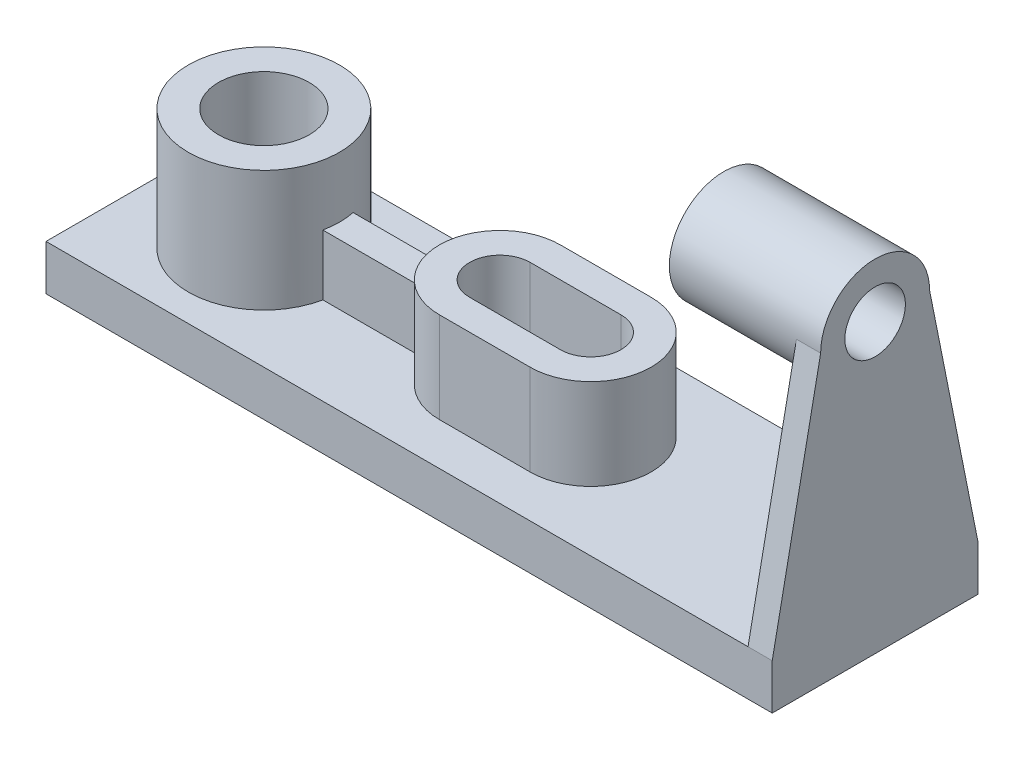
ISO-10303-21;
HEADER;
FILE_DESCRIPTION(('STEP AP214'),'2;1');
FILE_NAME('part.step','',(''),(''),'','','');
FILE_SCHEMA(('AUTOMOTIVE_DESIGN { 1 0 10303 214 1 1 1 1 }'));
ENDSEC;
DATA;
#1=APPLICATION_CONTEXT('core data for automotive mechanical design processes');
#2=APPLICATION_PROTOCOL_DEFINITION('international standard','automotive_design',2000,#1);
#3=PRODUCT_CONTEXT('',#1,'mechanical');
#4=PRODUCT('Part','Part','',(#3));
#5=PRODUCT_RELATED_PRODUCT_CATEGORY('part','',(#4));
#6=PRODUCT_DEFINITION_FORMATION('','',#4);
#7=PRODUCT_DEFINITION_CONTEXT('part definition',#1,'design');
#8=PRODUCT_DEFINITION('design','',#6,#7);
#9=PRODUCT_DEFINITION_SHAPE('','',#8);
#10=(LENGTH_UNIT() NAMED_UNIT(*) SI_UNIT(.MILLI.,.METRE.));
#11=(NAMED_UNIT(*) PLANE_ANGLE_UNIT() SI_UNIT($,.RADIAN.));
#12=(NAMED_UNIT(*) SI_UNIT($,.STERADIAN.) SOLID_ANGLE_UNIT());
#13=UNCERTAINTY_MEASURE_WITH_UNIT(LENGTH_MEASURE(1.E-05),#10,'distance_accuracy_value','');
#14=(GEOMETRIC_REPRESENTATION_CONTEXT(3) GLOBAL_UNCERTAINTY_ASSIGNED_CONTEXT((#13)) GLOBAL_UNIT_ASSIGNED_CONTEXT((#10,
#11,#12)) REPRESENTATION_CONTEXT('',''));
#15=CARTESIAN_POINT('',(0.,0.,0.));
#16=DIRECTION('',(0.,0.,1.));
#17=DIRECTION('',(1.,0.,0.));
#18=AXIS2_PLACEMENT_3D('',#15,#16,#17);
#19=CARTESIAN_POINT('',(112.,95.,0.));
#20=DIRECTION('',(1.,0.,0.));
#21=DIRECTION('',(0.,0.,-1.));
#22=AXIS2_PLACEMENT_3D('',#19,#20,#21);
#23=PLANE('',#22);
#24=CARTESIAN_POINT('',(112.,95.,0.));
#25=DIRECTION('',(1.,0.,0.));
#26=DIRECTION('',(0.,0.,-1.));
#27=AXIS2_PLACEMENT_3D('',#24,#25,#26);
#28=CIRCLE('',#27,18.);
#29=CARTESIAN_POINT('',(112.,95.,-18.));
#30=VERTEX_POINT('',#29);
#31=CARTESIAN_POINT('',(112.,95.,18.));
#32=VERTEX_POINT('',#31);
#33=EDGE_CURVE('E12',#30,#32,#28,.F.);
#34=ORIENTED_EDGE('',*,*,#33,.F.);
#35=DIRECTION('',(0.,0.98058067569092,0.196116135138183));
#36=VECTOR('',#35,1.);
#37=CARTESIAN_POINT('',(112.,95.,-18.));
#38=LINE('',#37,#36);
#39=CARTESIAN_POINT('',(112.,15.,-34.));
#40=VERTEX_POINT('',#39);
#41=EDGE_CURVE('E176',#40,#30,#38,.T.);
#42=ORIENTED_EDGE('',*,*,#41,.F.);
#43=DIRECTION('',(0.,0.,-1.));
#44=VECTOR('',#43,1.);
#45=CARTESIAN_POINT('',(112.,15.,34.));
#46=LINE('',#45,#44);
#47=CARTESIAN_POINT('',(112.,15.,34.));
#48=VERTEX_POINT('',#47);
#49=EDGE_CURVE('E58',#48,#40,#46,.T.);
#50=ORIENTED_EDGE('',*,*,#49,.F.);
#51=DIRECTION('',(0.,-0.98058067569092,0.196116135138185));
#52=VECTOR('',#51,1.);
#53=CARTESIAN_POINT('',(112.,95.,18.));
#54=LINE('',#53,#52);
#55=EDGE_CURVE('E178',#32,#48,#54,.T.);
#56=ORIENTED_EDGE('',*,*,#55,.F.);
#57=EDGE_LOOP('',(#34,#42,#50,#56));
#58=FACE_BOUND('',#57,.T.);
#59=ADVANCED_FACE('F43',(#58),#23,.F.);
#60=CARTESIAN_POINT('',(0.,15.,0.));
#61=DIRECTION('',(0.,1.,0.));
#62=DIRECTION('',(0.,0.,1.));
#63=AXIS2_PLACEMENT_3D('',#60,#61,#62);
#64=PLANE('',#63);
#65=DIRECTION('',(1.,0.,0.));
#66=VECTOR('',#65,1.);
#67=CARTESIAN_POINT('',(0.,15.,5.));
#68=LINE('',#67,#66);
#69=CARTESIAN_POINT('',(-57.5051025721682,15.,5.));
#70=VERTEX_POINT('',#69);
#71=CARTESIAN_POINT('',(-23.3649167310371,15.,5.));
#72=VERTEX_POINT('',#71);
#73=EDGE_CURVE('E224',#70,#72,#68,.T.);
#74=ORIENTED_EDGE('',*,*,#73,.F.);
#75=CARTESIAN_POINT('',(-82.,15.,0.));
#76=DIRECTION('',(0.,1.,0.));
#77=DIRECTION('',(0.,0.,1.));
#78=AXIS2_PLACEMENT_3D('',#75,#76,#77);
#79=CIRCLE('',#78,25.);
#80=CARTESIAN_POINT('',(-57.5051025721682,15.,-5.));
#81=VERTEX_POINT('',#80);
#82=EDGE_CURVE('E301',#81,#70,#79,.T.);
#83=ORIENTED_EDGE('',*,*,#82,.F.);
#84=DIRECTION('',(1.,0.,0.));
#85=VECTOR('',#84,1.);
#86=CARTESIAN_POINT('',(0.,15.,-5.));
#87=LINE('',#86,#85);
#88=CARTESIAN_POINT('',(-23.3649167310371,15.,-5.));
#89=VERTEX_POINT('',#88);
#90=EDGE_CURVE('E215',#81,#89,#87,.T.);
#91=ORIENTED_EDGE('',*,*,#90,.T.);
#92=CARTESIAN_POINT('',(-4.,15.,0.));
#93=DIRECTION('',(0.,1.,0.));
#94=DIRECTION('',(0.,0.,1.));
#95=AXIS2_PLACEMENT_3D('',#92,#93,#94);
#96=CIRCLE('',#95,20.);
#97=CARTESIAN_POINT('',(-4.,15.,-20.));
#98=VERTEX_POINT('',#97);
#99=EDGE_CURVE('E277',#98,#89,#96,.T.);
#100=ORIENTED_EDGE('',*,*,#99,.F.);
#101=DIRECTION('',(1.,0.,0.));
#102=VECTOR('',#101,1.);
#103=CARTESIAN_POINT('',(-4.,15.,-20.));
#104=LINE('',#103,#102);
#105=CARTESIAN_POINT('',(26.,15.,-20.));
#106=VERTEX_POINT('',#105);
#107=EDGE_CURVE('E269',#98,#106,#104,.T.);
#108=ORIENTED_EDGE('',*,*,#107,.T.);
#109=CARTESIAN_POINT('',(26.,15.,0.));
#110=DIRECTION('',(0.,1.,0.));
#111=DIRECTION('',(0.,0.,1.));
#112=AXIS2_PLACEMENT_3D('',#109,#110,#111);
#113=CIRCLE('',#112,20.);
#114=CARTESIAN_POINT('',(26.,15.,20.));
#115=VERTEX_POINT('',#114);
#116=EDGE_CURVE('E282',#115,#106,#113,.T.);
#117=ORIENTED_EDGE('',*,*,#116,.F.);
#118=DIRECTION('',(1.,0.,0.));
#119=VECTOR('',#118,1.);
#120=CARTESIAN_POINT('',(-4.,15.,20.));
#121=LINE('',#120,#119);
#122=CARTESIAN_POINT('',(-4.,15.,20.));
#123=VERTEX_POINT('',#122);
#124=EDGE_CURVE('E279',#123,#115,#121,.T.);
#125=ORIENTED_EDGE('',*,*,#124,.F.);
#126=EDGE_CURVE('E264',#72,#123,#96,.T.);
#127=ORIENTED_EDGE('',*,*,#126,.F.);
#128=EDGE_LOOP('',(#74,#83,#91,#100,#108,#117,#125,#127));
#129=FACE_BOUND('',#128,.T.);
#130=DIRECTION('',(1.,0.,0.));
#131=VECTOR('',#130,1.);
#132=CARTESIAN_POINT('',(-120.,15.,34.));
#133=LINE('',#132,#131);
#134=CARTESIAN_POINT('',(-120.,15.,34.));
#135=VERTEX_POINT('',#134);
#136=EDGE_CURVE('E311',#135,#48,#133,.T.);
#137=ORIENTED_EDGE('',*,*,#136,.T.);
#138=ORIENTED_EDGE('',*,*,#49,.T.);
#139=DIRECTION('',(-1.,0.,0.));
#140=VECTOR('',#139,1.);
#141=CARTESIAN_POINT('',(-120.,15.,-34.));
#142=LINE('',#141,#140);
#143=CARTESIAN_POINT('',(-120.,15.,-34.));
#144=VERTEX_POINT('',#143);
#145=EDGE_CURVE('E309',#40,#144,#142,.T.);
#146=ORIENTED_EDGE('',*,*,#145,.T.);
#147=DIRECTION('',(0.,0.,1.));
#148=VECTOR('',#147,1.);
#149=CARTESIAN_POINT('',(-120.,15.,-34.));
#150=LINE('',#149,#148);
#151=EDGE_CURVE('E308',#144,#135,#150,.T.);
#152=ORIENTED_EDGE('',*,*,#151,.T.);
#153=EDGE_LOOP('',(#137,#138,#146,#152));
#154=FACE_BOUND('',#153,.T.);
#155=ADVANCED_FACE('F357',(#129,#154),#64,.T.);
#156=CARTESIAN_POINT('',(120.,15.,-34.));
#157=DIRECTION('',(-1.,0.,0.));
#158=DIRECTION('',(0.,0.,1.));
#159=AXIS2_PLACEMENT_3D('',#156,#157,#158);
#160=PLANE('',#159);
#161=CARTESIAN_POINT('',(120.,95.,0.));
#162=DIRECTION('',(-1.,0.,0.));
#163=DIRECTION('',(0.,0.,1.));
#164=AXIS2_PLACEMENT_3D('',#161,#162,#163);
#165=CIRCLE('',#164,10.);
#166=CARTESIAN_POINT('',(120.,95.,9.99999999999995));
#167=VERTEX_POINT('',#166);
#168=EDGE_CURVE('E450',#167,#167,#165,.T.);
#169=ORIENTED_EDGE('',*,*,#168,.T.);
#170=EDGE_LOOP('',(#169));
#171=FACE_BOUND('',#170,.T.);
#172=DIRECTION('',(0.,0.,-1.));
#173=VECTOR('',#172,1.);
#174=CARTESIAN_POINT('',(120.,0.,-34.));
#175=LINE('',#174,#173);
#176=CARTESIAN_POINT('',(120.,0.,34.));
#177=VERTEX_POINT('',#176);
#178=CARTESIAN_POINT('',(120.,0.,-34.));
#179=VERTEX_POINT('',#178);
#180=EDGE_CURVE('E305',#177,#179,#175,.T.);
#181=ORIENTED_EDGE('',*,*,#180,.T.);
#182=DIRECTION('',(0.,-1.,0.));
#183=VECTOR('',#182,1.);
#184=CARTESIAN_POINT('',(120.,15.,-34.));
#185=LINE('',#184,#183);
#186=CARTESIAN_POINT('',(120.,15.,-34.));
#187=VERTEX_POINT('',#186);
#188=EDGE_CURVE('E51',#187,#179,#185,.T.);
#189=ORIENTED_EDGE('',*,*,#188,.F.);
#190=DIRECTION('',(0.,0.98058067569092,0.196116135138183));
#191=VECTOR('',#190,1.);
#192=CARTESIAN_POINT('',(120.,95.,-18.));
#193=LINE('',#192,#191);
#194=CARTESIAN_POINT('',(120.,95.,-18.));
#195=VERTEX_POINT('',#194);
#196=EDGE_CURVE('E206',#187,#195,#193,.T.);
#197=ORIENTED_EDGE('',*,*,#196,.T.);
#198=CARTESIAN_POINT('',(120.,95.,0.));
#199=DIRECTION('',(1.,0.,0.));
#200=DIRECTION('',(0.,0.,-1.));
#201=AXIS2_PLACEMENT_3D('',#198,#199,#200);
#202=CIRCLE('',#201,18.);
#203=CARTESIAN_POINT('',(120.,95.,17.9999999999999));
#204=VERTEX_POINT('',#203);
#205=EDGE_CURVE('E186',#195,#204,#202,.T.);
#206=ORIENTED_EDGE('',*,*,#205,.T.);
#207=DIRECTION('',(0.,-0.98058067569092,0.196116135138185));
#208=VECTOR('',#207,1.);
#209=CARTESIAN_POINT('',(120.,95.,17.9999999999999));
#210=LINE('',#209,#208);
#211=CARTESIAN_POINT('',(120.,15.,34.));
#212=VERTEX_POINT('',#211);
#213=EDGE_CURVE('E202',#204,#212,#210,.T.);
#214=ORIENTED_EDGE('',*,*,#213,.T.);
#215=DIRECTION('',(0.,-1.,0.));
#216=VECTOR('',#215,1.);
#217=CARTESIAN_POINT('',(120.,15.,34.));
#218=LINE('',#217,#216);
#219=EDGE_CURVE('E313',#212,#177,#218,.T.);
#220=ORIENTED_EDGE('',*,*,#219,.T.);
#221=EDGE_LOOP('',(#181,#189,#197,#206,#214,#220));
#222=FACE_BOUND('',#221,.T.);
#223=ADVANCED_FACE('F45',(#171,#222),#160,.F.);
#224=CARTESIAN_POINT('',(-120.,15.,-34.));
#225=DIRECTION('',(0.,0.,1.));
#226=DIRECTION('',(1.,0.,0.));
#227=AXIS2_PLACEMENT_3D('',#224,#225,#226);
#228=PLANE('',#227);
#229=DIRECTION('',(-1.,0.,0.));
#230=VECTOR('',#229,1.);
#231=CARTESIAN_POINT('',(-120.,0.,-34.));
#232=LINE('',#231,#230);
#233=CARTESIAN_POINT('',(-120.,0.,-34.));
#234=VERTEX_POINT('',#233);
#235=EDGE_CURVE('E315',#179,#234,#232,.T.);
#236=ORIENTED_EDGE('',*,*,#235,.T.);
#237=DIRECTION('',(0.,-1.,0.));
#238=VECTOR('',#237,1.);
#239=CARTESIAN_POINT('',(-120.,15.,-34.));
#240=LINE('',#239,#238);
#241=EDGE_CURVE('E326',#144,#234,#240,.T.);
#242=ORIENTED_EDGE('',*,*,#241,.F.);
#243=ORIENTED_EDGE('',*,*,#145,.F.);
#244=EDGE_CURVE('E194',#187,#40,#142,.T.);
#245=ORIENTED_EDGE('',*,*,#244,.F.);
#246=ORIENTED_EDGE('',*,*,#188,.T.);
#247=EDGE_LOOP('',(#236,#242,#243,#245,#246));
#248=FACE_BOUND('',#247,.T.);
#249=ADVANCED_FACE('F484',(#248),#228,.F.);
#250=CARTESIAN_POINT('',(-120.,15.,-34.));
#251=DIRECTION('',(1.,0.,0.));
#252=DIRECTION('',(0.,0.,-1.));
#253=AXIS2_PLACEMENT_3D('',#250,#251,#252);
#254=PLANE('',#253);
#255=DIRECTION('',(0.,-1.,0.));
#256=VECTOR('',#255,1.);
#257=CARTESIAN_POINT('',(-120.,15.,34.));
#258=LINE('',#257,#256);
#259=CARTESIAN_POINT('',(-120.,0.,34.));
#260=VERTEX_POINT('',#259);
#261=EDGE_CURVE('E323',#135,#260,#258,.T.);
#262=ORIENTED_EDGE('',*,*,#261,.F.);
#263=ORIENTED_EDGE('',*,*,#151,.F.);
#264=ORIENTED_EDGE('',*,*,#241,.T.);
#265=DIRECTION('',(0.,0.,1.));
#266=VECTOR('',#265,1.);
#267=CARTESIAN_POINT('',(-120.,0.,-34.));
#268=LINE('',#267,#266);
#269=EDGE_CURVE('E317',#234,#260,#268,.T.);
#270=ORIENTED_EDGE('',*,*,#269,.T.);
#271=EDGE_LOOP('',(#262,#263,#264,#270));
#272=FACE_BOUND('',#271,.T.);
#273=ADVANCED_FACE('F520',(#272),#254,.F.);
#274=CARTESIAN_POINT('',(-120.,15.,34.));
#275=DIRECTION('',(0.,0.,-1.));
#276=DIRECTION('',(-1.,0.,0.));
#277=AXIS2_PLACEMENT_3D('',#274,#275,#276);
#278=PLANE('',#277);
#279=DIRECTION('',(1.,0.,0.));
#280=VECTOR('',#279,1.);
#281=CARTESIAN_POINT('',(-120.,0.,34.));
#282=LINE('',#281,#280);
#283=EDGE_CURVE('E319',#260,#177,#282,.T.);
#284=ORIENTED_EDGE('',*,*,#283,.T.);
#285=ORIENTED_EDGE('',*,*,#219,.F.);
#286=DIRECTION('',(1.,0.,0.));
#287=VECTOR('',#286,1.);
#288=CARTESIAN_POINT('',(112.,15.,34.));
#289=LINE('',#288,#287);
#290=EDGE_CURVE('E66',#48,#212,#289,.T.);
#291=ORIENTED_EDGE('',*,*,#290,.F.);
#292=ORIENTED_EDGE('',*,*,#136,.F.);
#293=ORIENTED_EDGE('',*,*,#261,.T.);
#294=EDGE_LOOP('',(#284,#285,#291,#292,#293));
#295=FACE_BOUND('',#294,.T.);
#296=ADVANCED_FACE('F354',(#295),#278,.F.);
#297=CARTESIAN_POINT('',(0.,0.,0.));
#298=DIRECTION('',(0.,1.,0.));
#299=DIRECTION('',(0.,0.,1.));
#300=AXIS2_PLACEMENT_3D('',#297,#298,#299);
#301=PLANE('',#300);
#302=CARTESIAN_POINT('',(-82.,0.,0.));
#303=DIRECTION('',(0.,1.,0.));
#304=DIRECTION('',(0.,0.,1.));
#305=AXIS2_PLACEMENT_3D('',#302,#303,#304);
#306=CIRCLE('',#305,15.);
#307=CARTESIAN_POINT('',(-82.,0.,15.));
#308=VERTEX_POINT('',#307);
#309=EDGE_CURVE('E297',#308,#308,#306,.T.);
#310=ORIENTED_EDGE('',*,*,#309,.T.);
#311=EDGE_LOOP('',(#310));
#312=FACE_BOUND('',#311,.T.);
#313=CARTESIAN_POINT('',(-4.,0.,0.));
#314=DIRECTION('',(0.,1.,0.));
#315=DIRECTION('',(0.,0.,1.));
#316=AXIS2_PLACEMENT_3D('',#313,#314,#315);
#317=CIRCLE('',#316,10.);
#318=CARTESIAN_POINT('',(-4.,0.,-10.));
#319=VERTEX_POINT('',#318);
#320=CARTESIAN_POINT('',(-4.,0.,10.));
#321=VERTEX_POINT('',#320);
#322=EDGE_CURVE('E262',#319,#321,#317,.T.);
#323=ORIENTED_EDGE('',*,*,#322,.T.);
#324=DIRECTION('',(1.,0.,0.));
#325=VECTOR('',#324,1.);
#326=CARTESIAN_POINT('',(0.,0.,10.));
#327=LINE('',#326,#325);
#328=CARTESIAN_POINT('',(26.,0.,10.));
#329=VERTEX_POINT('',#328);
#330=EDGE_CURVE('E248',#321,#329,#327,.T.);
#331=ORIENTED_EDGE('',*,*,#330,.T.);
#332=CARTESIAN_POINT('',(26.,0.,0.));
#333=DIRECTION('',(0.,1.,0.));
#334=DIRECTION('',(0.,0.,1.));
#335=AXIS2_PLACEMENT_3D('',#332,#333,#334);
#336=CIRCLE('',#335,10.);
#337=CARTESIAN_POINT('',(26.,0.,-10.));
#338=VERTEX_POINT('',#337);
#339=EDGE_CURVE('E257',#329,#338,#336,.T.);
#340=ORIENTED_EDGE('',*,*,#339,.T.);
#341=DIRECTION('',(-1.,0.,0.));
#342=VECTOR('',#341,1.);
#343=CARTESIAN_POINT('',(0.,0.,-10.));
#344=LINE('',#343,#342);
#345=EDGE_CURVE('E259',#338,#319,#344,.T.);
#346=ORIENTED_EDGE('',*,*,#345,.T.);
#347=EDGE_LOOP('',(#323,#331,#340,#346));
#348=FACE_BOUND('',#347,.T.);
#349=ORIENTED_EDGE('',*,*,#283,.F.);
#350=ORIENTED_EDGE('',*,*,#269,.F.);
#351=ORIENTED_EDGE('',*,*,#235,.F.);
#352=ORIENTED_EDGE('',*,*,#180,.F.);
#353=EDGE_LOOP('',(#349,#350,#351,#352));
#354=FACE_BOUND('',#353,.T.);
#355=ADVANCED_FACE('F333',(#312,#348,#354),#301,.F.);
#356=CARTESIAN_POINT('',(-82.,55.,0.));
#357=DIRECTION('',(0.,1.,0.));
#358=DIRECTION('',(0.,0.,1.));
#359=AXIS2_PLACEMENT_3D('',#356,#357,#358);
#360=PLANE('',#359);
#361=CARTESIAN_POINT('',(-82.,55.,0.));
#362=DIRECTION('',(0.,1.,0.));
#363=DIRECTION('',(0.,0.,1.));
#364=AXIS2_PLACEMENT_3D('',#361,#362,#363);
#365=CIRCLE('',#364,25.);
#366=CARTESIAN_POINT('',(-82.,55.,25.));
#367=VERTEX_POINT('',#366);
#368=EDGE_CURVE('E302',#367,#367,#365,.T.);
#369=ORIENTED_EDGE('',*,*,#368,.T.);
#370=EDGE_LOOP('',(#369));
#371=FACE_BOUND('',#370,.T.);
#372=CARTESIAN_POINT('',(-82.,55.,0.));
#373=DIRECTION('',(0.,1.,0.));
#374=DIRECTION('',(0.,0.,1.));
#375=AXIS2_PLACEMENT_3D('',#372,#373,#374);
#376=CIRCLE('',#375,15.);
#377=CARTESIAN_POINT('',(-82.,55.,15.));
#378=VERTEX_POINT('',#377);
#379=EDGE_CURVE('E298',#378,#378,#376,.T.);
#380=ORIENTED_EDGE('',*,*,#379,.F.);
#381=EDGE_LOOP('',(#380));
#382=FACE_BOUND('',#381,.T.);
#383=ADVANCED_FACE('F344',(#371,#382),#360,.T.);
#384=CARTESIAN_POINT('',(-82.,55.,0.));
#385=DIRECTION('',(0.,-1.,0.));
#386=DIRECTION('',(0.,0.,-1.));
#387=AXIS2_PLACEMENT_3D('',#384,#385,#386);
#388=CYLINDRICAL_SURFACE('',#387,25.);
#389=ORIENTED_EDGE('',*,*,#82,.T.);
#390=DIRECTION('',(0.,-1.,0.));
#391=VECTOR('',#390,1.);
#392=CARTESIAN_POINT('',(-57.5051025721682,55.,5.));
#393=LINE('',#392,#391);
#394=CARTESIAN_POINT('',(-57.5051025721682,35.,5.));
#395=VERTEX_POINT('',#394);
#396=EDGE_CURVE('E227',#70,#395,#393,.F.);
#397=ORIENTED_EDGE('',*,*,#396,.T.);
#398=CARTESIAN_POINT('',(-82.,35.,0.));
#399=DIRECTION('',(0.,-1.,0.));
#400=DIRECTION('',(0.,0.,-1.));
#401=AXIS2_PLACEMENT_3D('',#398,#399,#400);
#402=CIRCLE('',#401,25.);
#403=CARTESIAN_POINT('',(-57.5051025721682,35.,-5.));
#404=VERTEX_POINT('',#403);
#405=EDGE_CURVE('E232',#395,#404,#402,.F.);
#406=ORIENTED_EDGE('',*,*,#405,.T.);
#407=DIRECTION('',(0.,-1.,0.));
#408=VECTOR('',#407,1.);
#409=CARTESIAN_POINT('',(-57.5051025721682,55.,-5.));
#410=LINE('',#409,#408);
#411=EDGE_CURVE('E218',#81,#404,#410,.F.);
#412=ORIENTED_EDGE('',*,*,#411,.F.);
#413=EDGE_LOOP('',(#389,#397,#406,#412));
#414=FACE_BOUND('',#413,.T.);
#415=ORIENTED_EDGE('',*,*,#368,.F.);
#416=EDGE_LOOP('',(#415));
#417=FACE_BOUND('',#416,.T.);
#418=ADVANCED_FACE('F340',(#414,#417),#388,.T.);
#419=CARTESIAN_POINT('',(-82.,55.,0.));
#420=DIRECTION('',(0.,-1.,0.));
#421=DIRECTION('',(0.,0.,-1.));
#422=AXIS2_PLACEMENT_3D('',#419,#420,#421);
#423=CYLINDRICAL_SURFACE('',#422,15.);
#424=ORIENTED_EDGE('',*,*,#309,.F.);
#425=EDGE_LOOP('',(#424));
#426=FACE_BOUND('',#425,.T.);
#427=ORIENTED_EDGE('',*,*,#379,.T.);
#428=EDGE_LOOP('',(#427));
#429=FACE_BOUND('',#428,.T.);
#430=ADVANCED_FACE('F336',(#426,#429),#423,.F.);
#431=CARTESIAN_POINT('',(-4.,45.,0.));
#432=DIRECTION('',(0.,-1.,0.));
#433=DIRECTION('',(0.,0.,-1.));
#434=AXIS2_PLACEMENT_3D('',#431,#432,#433);
#435=CYLINDRICAL_SURFACE('',#434,20.);
#436=CARTESIAN_POINT('',(-4.,35.,0.));
#437=DIRECTION('',(0.,-1.,0.));
#438=DIRECTION('',(0.,0.,-1.));
#439=AXIS2_PLACEMENT_3D('',#436,#437,#438);
#440=CIRCLE('',#439,20.);
#441=CARTESIAN_POINT('',(-23.3649167310371,35.,-5.));
#442=VERTEX_POINT('',#441);
#443=CARTESIAN_POINT('',(-23.3649167310371,35.,5.));
#444=VERTEX_POINT('',#443);
#445=EDGE_CURVE('E230',#442,#444,#440,.F.);
#446=ORIENTED_EDGE('',*,*,#445,.T.);
#447=DIRECTION('',(0.,-1.,0.));
#448=VECTOR('',#447,1.);
#449=CARTESIAN_POINT('',(-23.3649167310371,45.,5.));
#450=LINE('',#449,#448);
#451=EDGE_CURVE('E223',#444,#72,#450,.T.);
#452=ORIENTED_EDGE('',*,*,#451,.T.);
#453=ORIENTED_EDGE('',*,*,#126,.T.);
#454=DIRECTION('',(0.,-1.,0.));
#455=VECTOR('',#454,1.);
#456=CARTESIAN_POINT('',(-4.,45.,20.));
#457=LINE('',#456,#455);
#458=CARTESIAN_POINT('',(-4.,45.,20.));
#459=VERTEX_POINT('',#458);
#460=EDGE_CURVE('E294',#459,#123,#457,.T.);
#461=ORIENTED_EDGE('',*,*,#460,.F.);
#462=CARTESIAN_POINT('',(-4.,45.,0.));
#463=DIRECTION('',(0.,1.,0.));
#464=DIRECTION('',(0.,0.,1.));
#465=AXIS2_PLACEMENT_3D('',#462,#463,#464);
#466=CIRCLE('',#465,20.);
#467=CARTESIAN_POINT('',(-4.,45.,-20.));
#468=VERTEX_POINT('',#467);
#469=EDGE_CURVE('E265',#468,#459,#466,.T.);
#470=ORIENTED_EDGE('',*,*,#469,.F.);
#471=DIRECTION('',(0.,-1.,0.));
#472=VECTOR('',#471,1.);
#473=CARTESIAN_POINT('',(-4.,45.,-20.));
#474=LINE('',#473,#472);
#475=EDGE_CURVE('E276',#468,#98,#474,.T.);
#476=ORIENTED_EDGE('',*,*,#475,.T.);
#477=ORIENTED_EDGE('',*,*,#99,.T.);
#478=DIRECTION('',(0.,-1.,0.));
#479=VECTOR('',#478,1.);
#480=CARTESIAN_POINT('',(-23.3649167310371,45.,-5.));
#481=LINE('',#480,#479);
#482=EDGE_CURVE('E212',#442,#89,#481,.T.);
#483=ORIENTED_EDGE('',*,*,#482,.F.);
#484=EDGE_LOOP('',(#446,#452,#453,#461,#470,#476,#477,#483));
#485=FACE_BOUND('',#484,.T.);
#486=ADVANCED_FACE('F339',(#485),#435,.T.);
#487=CARTESIAN_POINT('',(-4.,45.,20.));
#488=DIRECTION('',(0.,0.,-1.));
#489=DIRECTION('',(-1.,0.,0.));
#490=AXIS2_PLACEMENT_3D('',#487,#488,#489);
#491=PLANE('',#490);
#492=ORIENTED_EDGE('',*,*,#124,.T.);
#493=DIRECTION('',(0.,-1.,0.));
#494=VECTOR('',#493,1.);
#495=CARTESIAN_POINT('',(26.,45.,20.));
#496=LINE('',#495,#494);
#497=CARTESIAN_POINT('',(26.,45.,20.));
#498=VERTEX_POINT('',#497);
#499=EDGE_CURVE('E291',#498,#115,#496,.T.);
#500=ORIENTED_EDGE('',*,*,#499,.F.);
#501=DIRECTION('',(1.,0.,0.));
#502=VECTOR('',#501,1.);
#503=CARTESIAN_POINT('',(-4.,45.,20.));
#504=LINE('',#503,#502);
#505=EDGE_CURVE('E268',#459,#498,#504,.T.);
#506=ORIENTED_EDGE('',*,*,#505,.F.);
#507=ORIENTED_EDGE('',*,*,#460,.T.);
#508=EDGE_LOOP('',(#492,#500,#506,#507));
#509=FACE_BOUND('',#508,.T.);
#510=ADVANCED_FACE('F415',(#509),#491,.F.);
#511=CARTESIAN_POINT('',(26.,45.,0.));
#512=DIRECTION('',(0.,-1.,0.));
#513=DIRECTION('',(0.,0.,-1.));
#514=AXIS2_PLACEMENT_3D('',#511,#512,#513);
#515=CYLINDRICAL_SURFACE('',#514,20.);
#516=ORIENTED_EDGE('',*,*,#116,.T.);
#517=DIRECTION('',(0.,-1.,0.));
#518=VECTOR('',#517,1.);
#519=CARTESIAN_POINT('',(26.,45.,-20.));
#520=LINE('',#519,#518);
#521=CARTESIAN_POINT('',(26.,45.,-20.));
#522=VERTEX_POINT('',#521);
#523=EDGE_CURVE('E288',#522,#106,#520,.T.);
#524=ORIENTED_EDGE('',*,*,#523,.F.);
#525=CARTESIAN_POINT('',(26.,45.,0.));
#526=DIRECTION('',(0.,1.,0.));
#527=DIRECTION('',(0.,0.,1.));
#528=AXIS2_PLACEMENT_3D('',#525,#526,#527);
#529=CIRCLE('',#528,20.);
#530=EDGE_CURVE('E271',#498,#522,#529,.T.);
#531=ORIENTED_EDGE('',*,*,#530,.F.);
#532=ORIENTED_EDGE('',*,*,#499,.T.);
#533=EDGE_LOOP('',(#516,#524,#531,#532));
#534=FACE_BOUND('',#533,.T.);
#535=ADVANCED_FACE('F411',(#534),#515,.T.);
#536=CARTESIAN_POINT('',(-4.,45.,-20.));
#537=DIRECTION('',(0.,0.,-1.));
#538=DIRECTION('',(-1.,0.,0.));
#539=AXIS2_PLACEMENT_3D('',#536,#537,#538);
#540=PLANE('',#539);
#541=ORIENTED_EDGE('',*,*,#107,.F.);
#542=ORIENTED_EDGE('',*,*,#475,.F.);
#543=DIRECTION('',(1.,0.,0.));
#544=VECTOR('',#543,1.);
#545=CARTESIAN_POINT('',(-4.,45.,-20.));
#546=LINE('',#545,#544);
#547=EDGE_CURVE('E273',#468,#522,#546,.T.);
#548=ORIENTED_EDGE('',*,*,#547,.T.);
#549=ORIENTED_EDGE('',*,*,#523,.T.);
#550=EDGE_LOOP('',(#541,#542,#548,#549));
#551=FACE_BOUND('',#550,.T.);
#552=ADVANCED_FACE('F407',(#551),#540,.T.);
#553=CARTESIAN_POINT('',(-4.,45.,0.));
#554=DIRECTION('',(0.,1.,0.));
#555=DIRECTION('',(0.,0.,1.));
#556=AXIS2_PLACEMENT_3D('',#553,#554,#555);
#557=PLANE('',#556);
#558=CARTESIAN_POINT('',(-4.,45.,0.));
#559=DIRECTION('',(0.,1.,0.));
#560=DIRECTION('',(0.,0.,1.));
#561=AXIS2_PLACEMENT_3D('',#558,#559,#560);
#562=CIRCLE('',#561,10.);
#563=CARTESIAN_POINT('',(-4.,45.,-10.));
#564=VERTEX_POINT('',#563);
#565=CARTESIAN_POINT('',(-4.,45.,10.));
#566=VERTEX_POINT('',#565);
#567=EDGE_CURVE('E234',#564,#566,#562,.T.);
#568=ORIENTED_EDGE('',*,*,#567,.F.);
#569=DIRECTION('',(-1.,0.,0.));
#570=VECTOR('',#569,1.);
#571=CARTESIAN_POINT('',(26.,45.,-10.));
#572=LINE('',#571,#570);
#573=CARTESIAN_POINT('',(26.,45.,-10.));
#574=VERTEX_POINT('',#573);
#575=EDGE_CURVE('E242',#574,#564,#572,.T.);
#576=ORIENTED_EDGE('',*,*,#575,.F.);
#577=CARTESIAN_POINT('',(26.,45.,0.));
#578=DIRECTION('',(0.,1.,0.));
#579=DIRECTION('',(0.,0.,1.));
#580=AXIS2_PLACEMENT_3D('',#577,#578,#579);
#581=CIRCLE('',#580,10.);
#582=CARTESIAN_POINT('',(26.,45.,10.));
#583=VERTEX_POINT('',#582);
#584=EDGE_CURVE('E239',#583,#574,#581,.T.);
#585=ORIENTED_EDGE('',*,*,#584,.F.);
#586=DIRECTION('',(1.,0.,0.));
#587=VECTOR('',#586,1.);
#588=CARTESIAN_POINT('',(-4.,45.,10.));
#589=LINE('',#588,#587);
#590=EDGE_CURVE('E236',#566,#583,#589,.T.);
#591=ORIENTED_EDGE('',*,*,#590,.F.);
#592=EDGE_LOOP('',(#568,#576,#585,#591));
#593=FACE_BOUND('',#592,.T.);
#594=ORIENTED_EDGE('',*,*,#469,.T.);
#595=ORIENTED_EDGE('',*,*,#505,.T.);
#596=ORIENTED_EDGE('',*,*,#530,.T.);
#597=ORIENTED_EDGE('',*,*,#547,.F.);
#598=EDGE_LOOP('',(#594,#595,#596,#597));
#599=FACE_BOUND('',#598,.T.);
#600=ADVANCED_FACE('F403',(#593,#599),#557,.T.);
#601=CARTESIAN_POINT('',(-4.,-32.,0.));
#602=DIRECTION('',(0.,1.,0.));
#603=DIRECTION('',(0.,0.,1.));
#604=AXIS2_PLACEMENT_3D('',#601,#602,#603);
#605=CYLINDRICAL_SURFACE('',#604,10.);
#606=DIRECTION('',(0.,1.,0.));
#607=VECTOR('',#606,1.);
#608=CARTESIAN_POINT('',(-4.,-32.,10.));
#609=LINE('',#608,#607);
#610=EDGE_CURVE('E245',#321,#566,#609,.T.);
#611=ORIENTED_EDGE('',*,*,#610,.F.);
#612=ORIENTED_EDGE('',*,*,#322,.F.);
#613=DIRECTION('',(0.,1.,0.));
#614=VECTOR('',#613,1.);
#615=CARTESIAN_POINT('',(-4.,-32.,-10.));
#616=LINE('',#615,#614);
#617=EDGE_CURVE('E246',#319,#564,#616,.T.);
#618=ORIENTED_EDGE('',*,*,#617,.T.);
#619=ORIENTED_EDGE('',*,*,#567,.T.);
#620=EDGE_LOOP('',(#611,#612,#618,#619));
#621=FACE_BOUND('',#620,.T.);
#622=ADVANCED_FACE('F393',(#621),#605,.F.);
#623=CARTESIAN_POINT('',(26.,-32.,-10.));
#624=DIRECTION('',(0.,0.,-1.));
#625=DIRECTION('',(-1.,0.,0.));
#626=AXIS2_PLACEMENT_3D('',#623,#624,#625);
#627=PLANE('',#626);
#628=DIRECTION('',(0.,1.,0.));
#629=VECTOR('',#628,1.);
#630=CARTESIAN_POINT('',(26.,-32.,-10.));
#631=LINE('',#630,#629);
#632=EDGE_CURVE('E249',#338,#574,#631,.T.);
#633=ORIENTED_EDGE('',*,*,#632,.T.);
#634=ORIENTED_EDGE('',*,*,#575,.T.);
#635=ORIENTED_EDGE('',*,*,#617,.F.);
#636=ORIENTED_EDGE('',*,*,#345,.F.);
#637=EDGE_LOOP('',(#633,#634,#635,#636));
#638=FACE_BOUND('',#637,.T.);
#639=ADVANCED_FACE('F389',(#638),#627,.F.);
#640=CARTESIAN_POINT('',(26.,-32.,0.));
#641=DIRECTION('',(0.,1.,0.));
#642=DIRECTION('',(0.,0.,1.));
#643=AXIS2_PLACEMENT_3D('',#640,#641,#642);
#644=CYLINDRICAL_SURFACE('',#643,10.);
#645=ORIENTED_EDGE('',*,*,#632,.F.);
#646=ORIENTED_EDGE('',*,*,#339,.F.);
#647=DIRECTION('',(0.,1.,0.));
#648=VECTOR('',#647,1.);
#649=CARTESIAN_POINT('',(26.,-32.,10.));
#650=LINE('',#649,#648);
#651=EDGE_CURVE('E251',#329,#583,#650,.T.);
#652=ORIENTED_EDGE('',*,*,#651,.T.);
#653=ORIENTED_EDGE('',*,*,#584,.T.);
#654=EDGE_LOOP('',(#645,#646,#652,#653));
#655=FACE_BOUND('',#654,.T.);
#656=ADVANCED_FACE('F392',(#655),#644,.F.);
#657=CARTESIAN_POINT('',(-4.,-32.,10.));
#658=DIRECTION('',(0.,0.,1.));
#659=DIRECTION('',(1.,0.,0.));
#660=AXIS2_PLACEMENT_3D('',#657,#658,#659);
#661=PLANE('',#660);
#662=ORIENTED_EDGE('',*,*,#610,.T.);
#663=ORIENTED_EDGE('',*,*,#590,.T.);
#664=ORIENTED_EDGE('',*,*,#651,.F.);
#665=ORIENTED_EDGE('',*,*,#330,.F.);
#666=EDGE_LOOP('',(#662,#663,#664,#665));
#667=FACE_BOUND('',#666,.T.);
#668=ADVANCED_FACE('F387',(#667),#661,.F.);
#669=CARTESIAN_POINT('',(-57.,35.,0.));
#670=DIRECTION('',(0.,-1.,0.));
#671=DIRECTION('',(1.,0.,0.));
#672=AXIS2_PLACEMENT_3D('',#669,#670,#671);
#673=PLANE('',#672);
#674=ORIENTED_EDGE('',*,*,#405,.F.);
#675=DIRECTION('',(1.,0.,0.));
#676=VECTOR('',#675,1.);
#677=CARTESIAN_POINT('',(0.,35.,5.));
#678=LINE('',#677,#676);
#679=EDGE_CURVE('E209',#395,#444,#678,.T.);
#680=ORIENTED_EDGE('',*,*,#679,.T.);
#681=ORIENTED_EDGE('',*,*,#445,.F.);
#682=DIRECTION('',(1.,0.,0.));
#683=VECTOR('',#682,1.);
#684=CARTESIAN_POINT('',(0.,35.,-5.));
#685=LINE('',#684,#683);
#686=EDGE_CURVE('E190',#404,#442,#685,.T.);
#687=ORIENTED_EDGE('',*,*,#686,.F.);
#688=EDGE_LOOP('',(#674,#680,#681,#687));
#689=FACE_BOUND('',#688,.T.);
#690=ADVANCED_FACE('F380',(#689),#673,.F.);
#691=CARTESIAN_POINT('',(0.,27.5,5.));
#692=DIRECTION('',(0.,0.,1.));
#693=DIRECTION('',(1.,0.,0.));
#694=AXIS2_PLACEMENT_3D('',#691,#692,#693);
#695=PLANE('',#694);
#696=ORIENTED_EDGE('',*,*,#396,.F.);
#697=ORIENTED_EDGE('',*,*,#73,.T.);
#698=ORIENTED_EDGE('',*,*,#451,.F.);
#699=ORIENTED_EDGE('',*,*,#679,.F.);
#700=EDGE_LOOP('',(#696,#697,#698,#699));
#701=FACE_BOUND('',#700,.T.);
#702=ADVANCED_FACE('F377',(#701),#695,.T.);
#703=CARTESIAN_POINT('',(0.,27.5,-5.));
#704=DIRECTION('',(0.,0.,1.));
#705=DIRECTION('',(1.,0.,0.));
#706=AXIS2_PLACEMENT_3D('',#703,#704,#705);
#707=PLANE('',#706);
#708=ORIENTED_EDGE('',*,*,#90,.F.);
#709=ORIENTED_EDGE('',*,*,#411,.T.);
#710=ORIENTED_EDGE('',*,*,#686,.T.);
#711=ORIENTED_EDGE('',*,*,#482,.T.);
#712=EDGE_LOOP('',(#708,#709,#710,#711));
#713=FACE_BOUND('',#712,.T.);
#714=ADVANCED_FACE('F376',(#713),#707,.F.);
#715=CARTESIAN_POINT('',(112.,95.,0.));
#716=DIRECTION('',(1.,0.,0.));
#717=DIRECTION('',(0.,0.,-1.));
#718=AXIS2_PLACEMENT_3D('',#715,#716,#717);
#719=CYLINDRICAL_SURFACE('',#718,18.);
#720=ORIENTED_EDGE('',*,*,#205,.F.);
#721=DIRECTION('',(1.,0.,0.));
#722=VECTOR('',#721,1.);
#723=CARTESIAN_POINT('',(112.,95.,-18.));
#724=LINE('',#723,#722);
#725=EDGE_CURVE('E182',#30,#195,#724,.T.);
#726=ORIENTED_EDGE('',*,*,#725,.F.);
#727=ORIENTED_EDGE('',*,*,#33,.T.);
#728=DIRECTION('',(1.,0.,0.));
#729=VECTOR('',#728,1.);
#730=CARTESIAN_POINT('',(112.,95.,18.));
#731=LINE('',#730,#729);
#732=EDGE_CURVE('E195',#32,#204,#731,.T.);
#733=ORIENTED_EDGE('',*,*,#732,.T.);
#734=EDGE_LOOP('',(#720,#726,#727,#733));
#735=FACE_BOUND('',#734,.T.);
#736=CARTESIAN_POINT('',(70.,95.,0.));
#737=DIRECTION('',(-1.,0.,0.));
#738=DIRECTION('',(0.,0.,1.));
#739=AXIS2_PLACEMENT_3D('',#736,#737,#738);
#740=CIRCLE('',#739,18.);
#741=CARTESIAN_POINT('',(70.,95.,18.));
#742=VERTEX_POINT('',#741);
#743=EDGE_CURVE('E203',#742,#742,#740,.T.);
#744=ORIENTED_EDGE('',*,*,#743,.F.);
#745=EDGE_LOOP('',(#744));
#746=FACE_BOUND('',#745,.T.);
#747=ADVANCED_FACE('F183',(#735,#746),#719,.T.);
#748=CARTESIAN_POINT('',(112.,95.,-18.));
#749=DIRECTION('',(0.,0.196116135138183,-0.98058067569092));
#750=DIRECTION('',(0.,0.98058067569092,0.196116135138183));
#751=AXIS2_PLACEMENT_3D('',#748,#749,#750);
#752=PLANE('',#751);
#753=ORIENTED_EDGE('',*,*,#196,.F.);
#754=ORIENTED_EDGE('',*,*,#244,.T.);
#755=ORIENTED_EDGE('',*,*,#41,.T.);
#756=ORIENTED_EDGE('',*,*,#725,.T.);
#757=EDGE_LOOP('',(#753,#754,#755,#756));
#758=FACE_BOUND('',#757,.T.);
#759=ADVANCED_FACE('F193',(#758),#752,.T.);
#760=CARTESIAN_POINT('',(112.,95.,18.));
#761=DIRECTION('',(0.,0.196116135138185,0.98058067569092));
#762=DIRECTION('',(0.,-0.98058067569092,0.196116135138185));
#763=AXIS2_PLACEMENT_3D('',#760,#761,#762);
#764=PLANE('',#763);
#765=ORIENTED_EDGE('',*,*,#213,.F.);
#766=ORIENTED_EDGE('',*,*,#732,.F.);
#767=ORIENTED_EDGE('',*,*,#55,.T.);
#768=ORIENTED_EDGE('',*,*,#290,.T.);
#769=EDGE_LOOP('',(#765,#766,#767,#768));
#770=FACE_BOUND('',#769,.T.);
#771=ADVANCED_FACE('F370',(#770),#764,.T.);
#772=CARTESIAN_POINT('',(70.,95.,0.));
#773=DIRECTION('',(-1.,0.,0.));
#774=DIRECTION('',(0.,0.,1.));
#775=AXIS2_PLACEMENT_3D('',#772,#773,#774);
#776=PLANE('',#775);
#777=CARTESIAN_POINT('',(70.,95.,0.));
#778=DIRECTION('',(-1.,0.,0.));
#779=DIRECTION('',(0.,0.,1.));
#780=AXIS2_PLACEMENT_3D('',#777,#778,#779);
#781=CIRCLE('',#780,10.);
#782=CARTESIAN_POINT('',(70.,95.,9.99999999999997));
#783=VERTEX_POINT('',#782);
#784=EDGE_CURVE('E453',#783,#783,#781,.T.);
#785=ORIENTED_EDGE('',*,*,#784,.F.);
#786=EDGE_LOOP('',(#785));
#787=FACE_BOUND('',#786,.T.);
#788=ORIENTED_EDGE('',*,*,#743,.T.);
#789=EDGE_LOOP('',(#788));
#790=FACE_BOUND('',#789,.T.);
#791=ADVANCED_FACE('F366',(#787,#790),#776,.T.);
#792=CARTESIAN_POINT('',(137.,95.,0.));
#793=DIRECTION('',(-1.,0.,0.));
#794=DIRECTION('',(0.,0.,1.));
#795=AXIS2_PLACEMENT_3D('',#792,#793,#794);
#796=CYLINDRICAL_SURFACE('',#795,10.);
#797=ORIENTED_EDGE('',*,*,#784,.T.);
#798=EDGE_LOOP('',(#797));
#799=FACE_BOUND('',#798,.T.);
#800=ORIENTED_EDGE('',*,*,#168,.F.);
#801=EDGE_LOOP('',(#800));
#802=FACE_BOUND('',#801,.T.);
#803=ADVANCED_FACE('F457',(#799,#802),#796,.F.);
#804=CLOSED_SHELL('',(#59,#155,#223,#249,#273,#296,#355,#383,#418,#430,#486,#510,#535,#552,#600,
#622,#639,#656,#668,#690,#702,#714,#747,#759,#771,#791,#803));
#805=MANIFOLD_SOLID_BREP('B2',#804);
#806=ADVANCED_BREP_SHAPE_REPRESENTATION('',(#18,#805),#14);
#807=SHAPE_DEFINITION_REPRESENTATION(#9,#806);
ENDSEC;
END-ISO-10303-21;
